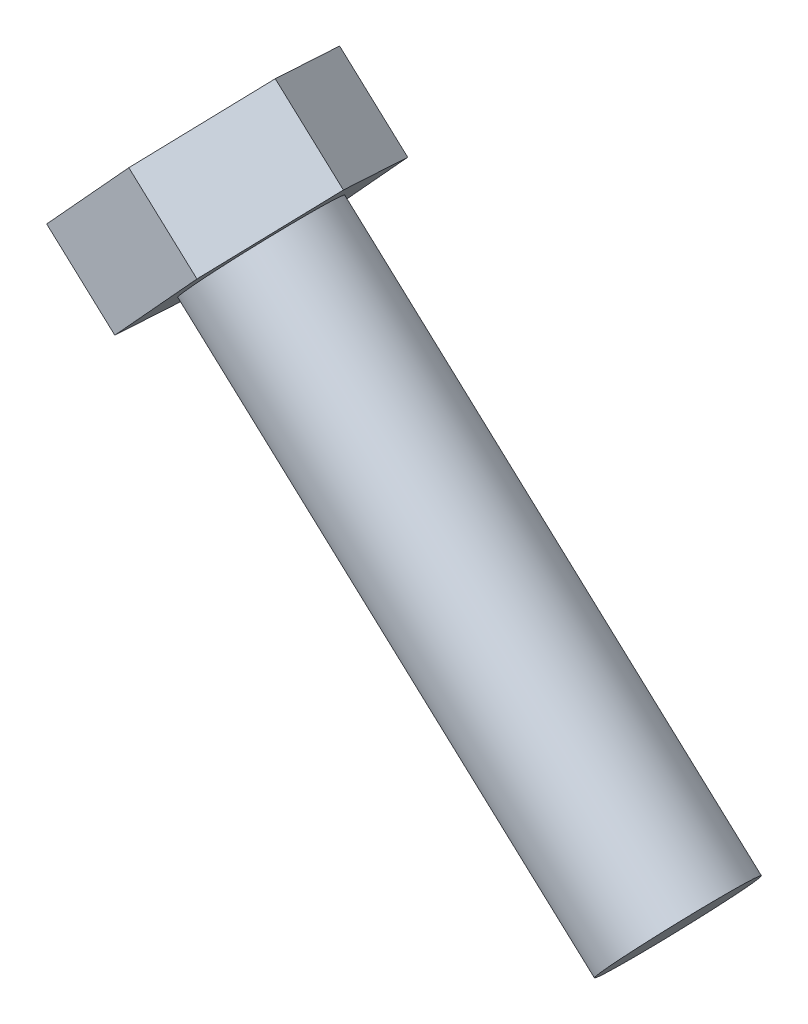
ISO-10303-21;
HEADER;
FILE_DESCRIPTION(('STEP AP214'),'2;1');
FILE_NAME('part.step','',(''),(''),'','','');
FILE_SCHEMA(('AUTOMOTIVE_DESIGN { 1 0 10303 214 1 1 1 1 }'));
ENDSEC;
DATA;
#1=APPLICATION_CONTEXT('core data for automotive mechanical design processes');
#2=APPLICATION_PROTOCOL_DEFINITION('international standard','automotive_design',2000,#1);
#3=PRODUCT_CONTEXT('',#1,'mechanical');
#4=PRODUCT('Part','Part','',(#3));
#5=PRODUCT_RELATED_PRODUCT_CATEGORY('part','',(#4));
#6=PRODUCT_DEFINITION_FORMATION('','',#4);
#7=PRODUCT_DEFINITION_CONTEXT('part definition',#1,'design');
#8=PRODUCT_DEFINITION('design','',#6,#7);
#9=PRODUCT_DEFINITION_SHAPE('','',#8);
#10=(LENGTH_UNIT() NAMED_UNIT(*) SI_UNIT(.MILLI.,.METRE.));
#11=(NAMED_UNIT(*) PLANE_ANGLE_UNIT() SI_UNIT($,.RADIAN.));
#12=(NAMED_UNIT(*) SI_UNIT($,.STERADIAN.) SOLID_ANGLE_UNIT());
#13=UNCERTAINTY_MEASURE_WITH_UNIT(LENGTH_MEASURE(1.E-05),#10,'distance_accuracy_value','');
#14=(GEOMETRIC_REPRESENTATION_CONTEXT(3) GLOBAL_UNCERTAINTY_ASSIGNED_CONTEXT((#13)) GLOBAL_UNIT_ASSIGNED_CONTEXT((#10,
#11,#12)) REPRESENTATION_CONTEXT('',''));
#15=CARTESIAN_POINT('',(0.,0.,0.));
#16=DIRECTION('',(0.,0.,1.));
#17=DIRECTION('',(1.,0.,0.));
#18=AXIS2_PLACEMENT_3D('',#15,#16,#17);
#19=CARTESIAN_POINT('',(19.7401172323591,65.5117349268509,0.));
#20=DIRECTION('',(-0.737900796388129,0.674909189958001,0.));
#21=DIRECTION('',(0.,0.,1.));
#22=AXIS2_PLACEMENT_3D('',#19,#20,#21);
#23=PLANE('',#22);
#24=DIRECTION('',(-0.337454594979002,-0.368950398194066,-0.866025403784437));
#25=VECTOR('',#24,1.);
#26=CARTESIAN_POINT('',(23.7438634830549,69.8891646475933,-23.425));
#27=LINE('',#26,#25);
#28=CARTESIAN_POINT('',(25.0784455666201,71.3483078878408,-20.));
#29=VERTEX_POINT('',#28);
#30=CARTESIAN_POINT('',(22.4092813994896,68.4300214073459,-26.85));
#31=VERTEX_POINT('',#30);
#32=EDGE_CURVE('E142',#29,#31,#27,.T.);
#33=ORIENTED_EDGE('',*,*,#32,.T.);
#34=DIRECTION('',(-0.674909189958001,-0.737900796388129,0.));
#35=VECTOR('',#34,1.);
#36=CARTESIAN_POINT('',(18.4055351487938,64.0525916866034,-26.85));
#37=LINE('',#36,#35);
#38=CARTESIAN_POINT('',(17.0709530652286,62.5934484463558,-26.85));
#39=VERTEX_POINT('',#38);
#40=EDGE_CURVE('E110',#31,#39,#37,.T.);
#41=ORIENTED_EDGE('',*,*,#40,.T.);
#42=DIRECTION('',(-0.337454594978999,-0.368950398194063,0.86602540378444));
#43=VECTOR('',#42,1.);
#44=CARTESIAN_POINT('',(15.7363709816633,61.1343052061084,-23.425));
#45=LINE('',#44,#43);
#46=CARTESIAN_POINT('',(14.401788898098,59.6751619658609,-20.));
#47=VERTEX_POINT('',#46);
#48=EDGE_CURVE('E95',#39,#47,#45,.T.);
#49=ORIENTED_EDGE('',*,*,#48,.T.);
#50=DIRECTION('',(0.337454594979002,0.368950398194066,0.866025403784437));
#51=VECTOR('',#50,1.);
#52=CARTESIAN_POINT('',(15.7363709816633,61.1343052061084,-16.575));
#53=LINE('',#52,#51);
#54=CARTESIAN_POINT('',(17.0709530652286,62.5934484463559,-13.15));
#55=VERTEX_POINT('',#54);
#56=EDGE_CURVE('E130',#47,#55,#53,.T.);
#57=ORIENTED_EDGE('',*,*,#56,.T.);
#58=DIRECTION('',(0.674909189958001,0.737900796388129,0.));
#59=VECTOR('',#58,1.);
#60=CARTESIAN_POINT('',(18.4055351487938,64.0525916866034,-13.15));
#61=LINE('',#60,#59);
#62=CARTESIAN_POINT('',(22.4092813994896,68.4300214073459,-13.15));
#63=VERTEX_POINT('',#62);
#64=EDGE_CURVE('E123',#55,#63,#61,.T.);
#65=ORIENTED_EDGE('',*,*,#64,.T.);
#66=DIRECTION('',(0.337454594978999,0.368950398194063,-0.86602540378444));
#67=VECTOR('',#66,1.);
#68=CARTESIAN_POINT('',(23.7438634830549,69.8891646475933,-16.575));
#69=LINE('',#68,#67);
#70=EDGE_CURVE('E25',#63,#29,#69,.T.);
#71=ORIENTED_EDGE('',*,*,#70,.T.);
#72=EDGE_LOOP('',(#33,#41,#49,#57,#65,#71));
#73=FACE_BOUND('',#72,.T.);
#74=ADVANCED_FACE('F16',(#73),#23,.T.);
#75=CARTESIAN_POINT('',(24.1675220106879,61.4622797871028,0.));
#76=DIRECTION('',(-0.737900796388129,0.674909189958001,0.));
#77=DIRECTION('',(0.,0.,1.));
#78=AXIS2_PLACEMENT_3D('',#75,#76,#77);
#79=PLANE('',#78);
#80=CARTESIAN_POINT('',(24.1675220106879,61.4622797871028,-20.));
#81=DIRECTION('',(-0.737900796388129,0.674909189958001,0.));
#82=DIRECTION('',(-0.674909189958001,-0.737900796388129,0.));
#83=AXIS2_PLACEMENT_3D('',#80,#81,#82);
#84=CIRCLE('',#83,4.5);
#85=CARTESIAN_POINT('',(21.1304306558769,58.1417262033562,-20.));
#86=VERTEX_POINT('',#85);
#87=EDGE_CURVE('E153',#86,#86,#84,.T.);
#88=ORIENTED_EDGE('',*,*,#87,.T.);
#89=EDGE_LOOP('',(#88));
#90=FACE_BOUND('',#89,.T.);
#91=DIRECTION('',(-0.337454594979002,-0.368950398194066,-0.866025403784437));
#92=VECTOR('',#91,1.);
#93=CARTESIAN_POINT('',(28.1712682613836,65.8397095078453,-23.425));
#94=LINE('',#93,#92);
#95=CARTESIAN_POINT('',(29.5058503449489,67.2988527480928,-20.));
#96=VERTEX_POINT('',#95);
#97=CARTESIAN_POINT('',(26.8366861778183,64.3805662675978,-26.85));
#98=VERTEX_POINT('',#97);
#99=EDGE_CURVE('E149',#96,#98,#94,.T.);
#100=ORIENTED_EDGE('',*,*,#99,.F.);
#101=DIRECTION('',(0.337454594978999,0.368950398194063,-0.86602540378444));
#102=VECTOR('',#101,1.);
#103=CARTESIAN_POINT('',(28.1712682613837,65.8397095078454,-16.575));
#104=LINE('',#103,#102);
#105=CARTESIAN_POINT('',(26.8366861778184,64.3805662675979,-13.15));
#106=VERTEX_POINT('',#105);
#107=EDGE_CURVE('E11',#106,#96,#104,.T.);
#108=ORIENTED_EDGE('',*,*,#107,.F.);
#109=DIRECTION('',(0.674909189958001,0.737900796388129,0.));
#110=VECTOR('',#109,1.);
#111=CARTESIAN_POINT('',(22.8329399271226,60.0031365468553,-13.15));
#112=LINE('',#111,#110);
#113=CARTESIAN_POINT('',(21.4983578435573,58.5439933066079,-13.15));
#114=VERTEX_POINT('',#113);
#115=EDGE_CURVE('E127',#114,#106,#112,.T.);
#116=ORIENTED_EDGE('',*,*,#115,.F.);
#117=DIRECTION('',(0.337454594979002,0.368950398194066,0.866025403784437));
#118=VECTOR('',#117,1.);
#119=CARTESIAN_POINT('',(20.1637757599921,57.0848500663604,-16.575));
#120=LINE('',#119,#118);
#121=CARTESIAN_POINT('',(18.8291936764268,55.6257068261128,-20.));
#122=VERTEX_POINT('',#121);
#123=EDGE_CURVE('E89',#122,#114,#120,.T.);
#124=ORIENTED_EDGE('',*,*,#123,.F.);
#125=DIRECTION('',(-0.337454594978999,-0.368950398194063,0.86602540378444));
#126=VECTOR('',#125,1.);
#127=CARTESIAN_POINT('',(20.1637757599921,57.0848500663603,-23.425));
#128=LINE('',#127,#126);
#129=CARTESIAN_POINT('',(21.4983578435573,58.5439933066078,-26.85));
#130=VERTEX_POINT('',#129);
#131=EDGE_CURVE('E83',#130,#122,#128,.T.);
#132=ORIENTED_EDGE('',*,*,#131,.F.);
#133=DIRECTION('',(-0.674909189958001,-0.737900796388129,0.));
#134=VECTOR('',#133,1.);
#135=CARTESIAN_POINT('',(22.8329399271226,60.0031365468553,-26.85));
#136=LINE('',#135,#134);
#137=EDGE_CURVE('E86',#98,#130,#136,.T.);
#138=ORIENTED_EDGE('',*,*,#137,.F.);
#139=EDGE_LOOP('',(#100,#108,#116,#124,#132,#138));
#140=FACE_BOUND('',#139,.T.);
#141=ADVANCED_FACE('F18',(#90,#140),#79,.F.);
#142=CARTESIAN_POINT('',(28.1712682613837,65.8397095078454,-16.575));
#143=DIRECTION('',(0.584488503751206,0.639040835144888,0.5));
#144=DIRECTION('',(0.650048979584331,0.,-0.759892310884489));
#145=AXIS2_PLACEMENT_3D('',#142,#143,#144);
#146=PLANE('',#145);
#147=ORIENTED_EDGE('',*,*,#70,.F.);
#148=DIRECTION('',(-0.737900796388129,0.674909189958001,0.));
#149=VECTOR('',#148,1.);
#150=CARTESIAN_POINT('',(26.8366861778184,64.3805662675979,-13.15));
#151=LINE('',#150,#149);
#152=EDGE_CURVE('E134',#106,#63,#151,.T.);
#153=ORIENTED_EDGE('',*,*,#152,.F.);
#154=ORIENTED_EDGE('',*,*,#107,.T.);
#155=DIRECTION('',(-0.737900796388129,0.674909189958001,0.));
#156=VECTOR('',#155,1.);
#157=CARTESIAN_POINT('',(29.5058503449489,67.2988527480928,-20.));
#158=LINE('',#157,#156);
#159=EDGE_CURVE('E145',#96,#29,#158,.T.);
#160=ORIENTED_EDGE('',*,*,#159,.T.);
#161=EDGE_LOOP('',(#147,#153,#154,#160));
#162=FACE_BOUND('',#161,.T.);
#163=ADVANCED_FACE('F146',(#162),#146,.T.);
#164=CARTESIAN_POINT('',(22.8329399271226,60.0031365468553,-13.15));
#165=DIRECTION('',(0.,0.,1.));
#166=DIRECTION('',(0.,-1.,0.));
#167=AXIS2_PLACEMENT_3D('',#164,#165,#166);
#168=PLANE('',#167);
#169=ORIENTED_EDGE('',*,*,#64,.F.);
#170=DIRECTION('',(-0.737900796388129,0.674909189958001,0.));
#171=VECTOR('',#170,1.);
#172=CARTESIAN_POINT('',(21.4983578435573,58.5439933066079,-13.15));
#173=LINE('',#172,#171);
#174=EDGE_CURVE('E118',#114,#55,#173,.T.);
#175=ORIENTED_EDGE('',*,*,#174,.F.);
#176=ORIENTED_EDGE('',*,*,#115,.T.);
#177=ORIENTED_EDGE('',*,*,#152,.T.);
#178=EDGE_LOOP('',(#169,#175,#176,#177));
#179=FACE_BOUND('',#178,.T.);
#180=ADVANCED_FACE('F202',(#179),#168,.T.);
#181=CARTESIAN_POINT('',(20.1637757599921,57.0848500663604,-16.575));
#182=DIRECTION('',(-0.584488503751206,-0.639040835144888,0.5));
#183=DIRECTION('',(-0.737900796388129,0.674909189958001,0.));
#184=AXIS2_PLACEMENT_3D('',#181,#182,#183);
#185=PLANE('',#184);
#186=ORIENTED_EDGE('',*,*,#56,.F.);
#187=DIRECTION('',(-0.737900796388129,0.674909189958001,0.));
#188=VECTOR('',#187,1.);
#189=CARTESIAN_POINT('',(18.8291936764268,55.6257068261128,-20.));
#190=LINE('',#189,#188);
#191=EDGE_CURVE('E94',#122,#47,#190,.T.);
#192=ORIENTED_EDGE('',*,*,#191,.F.);
#193=ORIENTED_EDGE('',*,*,#123,.T.);
#194=ORIENTED_EDGE('',*,*,#174,.T.);
#195=EDGE_LOOP('',(#186,#192,#193,#194));
#196=FACE_BOUND('',#195,.T.);
#197=ADVANCED_FACE('F208',(#196),#185,.T.);
#198=CARTESIAN_POINT('',(20.1637757599921,57.0848500663603,-23.425));
#199=DIRECTION('',(-0.584488503751206,-0.639040835144888,-0.5));
#200=DIRECTION('',(-0.737900796388129,0.674909189958001,0.));
#201=AXIS2_PLACEMENT_3D('',#198,#199,#200);
#202=PLANE('',#201);
#203=ORIENTED_EDGE('',*,*,#48,.F.);
#204=DIRECTION('',(-0.737900796388129,0.674909189958001,0.));
#205=VECTOR('',#204,1.);
#206=CARTESIAN_POINT('',(21.4983578435573,58.5439933066078,-26.85));
#207=LINE('',#206,#205);
#208=EDGE_CURVE('E98',#130,#39,#207,.T.);
#209=ORIENTED_EDGE('',*,*,#208,.F.);
#210=ORIENTED_EDGE('',*,*,#131,.T.);
#211=ORIENTED_EDGE('',*,*,#191,.T.);
#212=EDGE_LOOP('',(#203,#209,#210,#211));
#213=FACE_BOUND('',#212,.T.);
#214=ADVANCED_FACE('F99',(#213),#202,.T.);
#215=CARTESIAN_POINT('',(22.8329399271226,60.0031365468553,-26.85));
#216=DIRECTION('',(0.,0.,-1.));
#217=DIRECTION('',(0.,-1.,0.));
#218=AXIS2_PLACEMENT_3D('',#215,#216,#217);
#219=PLANE('',#218);
#220=ORIENTED_EDGE('',*,*,#40,.F.);
#221=DIRECTION('',(-0.737900796388129,0.674909189958001,0.));
#222=VECTOR('',#221,1.);
#223=CARTESIAN_POINT('',(26.8366861778183,64.3805662675978,-26.85));
#224=LINE('',#223,#222);
#225=EDGE_CURVE('E107',#98,#31,#224,.T.);
#226=ORIENTED_EDGE('',*,*,#225,.F.);
#227=ORIENTED_EDGE('',*,*,#137,.T.);
#228=ORIENTED_EDGE('',*,*,#208,.T.);
#229=EDGE_LOOP('',(#220,#226,#227,#228));
#230=FACE_BOUND('',#229,.T.);
#231=ADVANCED_FACE('F105',(#230),#219,.T.);
#232=CARTESIAN_POINT('',(28.1712682613836,65.8397095078453,-23.425));
#233=DIRECTION('',(0.584488503751206,0.639040835144888,-0.5));
#234=DIRECTION('',(-0.650048979584333,0.,-0.759892310884488));
#235=AXIS2_PLACEMENT_3D('',#232,#233,#234);
#236=PLANE('',#235);
#237=ORIENTED_EDGE('',*,*,#32,.F.);
#238=ORIENTED_EDGE('',*,*,#159,.F.);
#239=ORIENTED_EDGE('',*,*,#99,.T.);
#240=ORIENTED_EDGE('',*,*,#225,.T.);
#241=EDGE_LOOP('',(#237,#238,#239,#240));
#242=FACE_BOUND('',#241,.T.);
#243=ADVANCED_FACE('F151',(#242),#236,.T.);
#244=CARTESIAN_POINT('',(51.2484812381322,36.6931125156442,0.));
#245=DIRECTION('',(-0.737900796388129,0.674909189958001,0.));
#246=DIRECTION('',(0.,0.,1.));
#247=AXIS2_PLACEMENT_3D('',#244,#245,#246);
#248=PLANE('',#247);
#249=CARTESIAN_POINT('',(51.2484812381322,36.6931125156442,-20.));
#250=DIRECTION('',(-0.737900796388129,0.674909189958001,0.));
#251=DIRECTION('',(-0.674909189958001,-0.737900796388129,0.));
#252=AXIS2_PLACEMENT_3D('',#249,#250,#251);
#253=CIRCLE('',#252,4.5);
#254=CARTESIAN_POINT('',(48.2113898833212,33.3725589318976,-20.));
#255=VERTEX_POINT('',#254);
#256=EDGE_CURVE('E159',#255,#255,#253,.T.);
#257=ORIENTED_EDGE('',*,*,#256,.F.);
#258=EDGE_LOOP('',(#257));
#259=FACE_BOUND('',#258,.T.);
#260=ADVANCED_FACE('F184',(#259),#248,.F.);
#261=CARTESIAN_POINT('',(51.2484812381322,36.6931125156442,-20.));
#262=DIRECTION('',(-0.737900796388129,0.674909189958001,0.));
#263=DIRECTION('',(-0.674909189958001,-0.737900796388129,0.));
#264=AXIS2_PLACEMENT_3D('',#261,#262,#263);
#265=CYLINDRICAL_SURFACE('',#264,4.5);
#266=ORIENTED_EDGE('',*,*,#87,.F.);
#267=EDGE_LOOP('',(#266));
#268=FACE_BOUND('',#267,.T.);
#269=ORIENTED_EDGE('',*,*,#256,.T.);
#270=EDGE_LOOP('',(#269));
#271=FACE_BOUND('',#270,.T.);
#272=ADVANCED_FACE('F182',(#268,#271),#265,.T.);
#273=CLOSED_SHELL('',(#74,#141,#163,#180,#197,#214,#231,#243,#260,#272));
#274=MANIFOLD_SOLID_BREP('B1',#273);
#275=ADVANCED_BREP_SHAPE_REPRESENTATION('',(#18,#274),#14);
#276=SHAPE_DEFINITION_REPRESENTATION(#9,#275);
ENDSEC;
END-ISO-10303-21;
